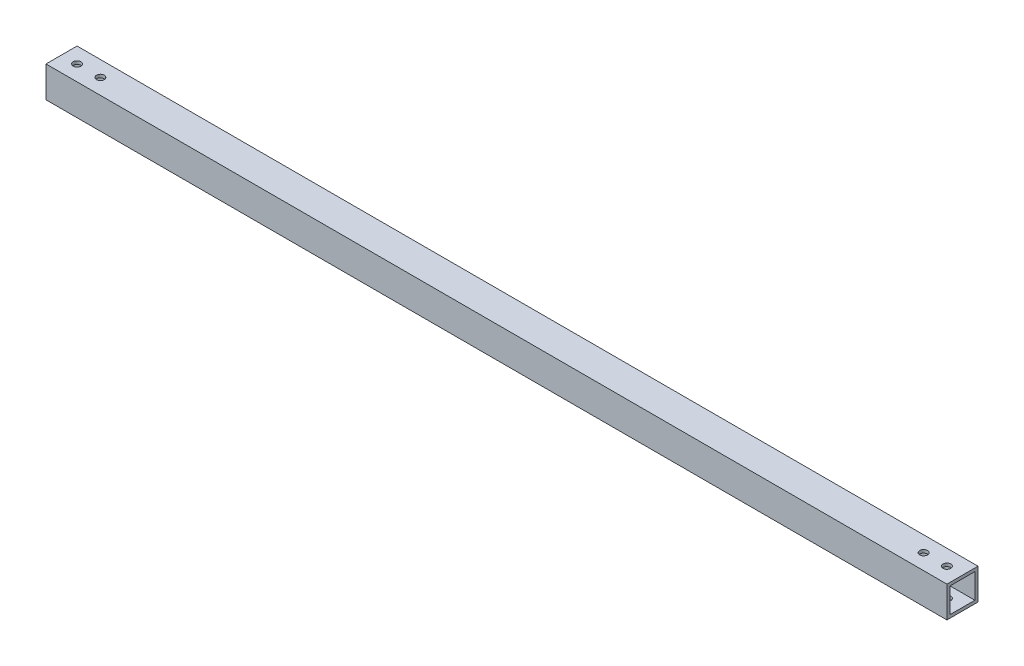
ISO-10303-21;
HEADER;
FILE_DESCRIPTION(('STEP AP214'),'2;1');
FILE_NAME('part.step','',(''),(''),'','','');
FILE_SCHEMA(('AUTOMOTIVE_DESIGN { 1 0 10303 214 1 1 1 1 }'));
ENDSEC;
DATA;
#1=APPLICATION_CONTEXT('core data for automotive mechanical design processes');
#2=APPLICATION_PROTOCOL_DEFINITION('international standard','automotive_design',2000,#1);
#3=PRODUCT_CONTEXT('',#1,'mechanical');
#4=PRODUCT('Part','Part','',(#3));
#5=PRODUCT_RELATED_PRODUCT_CATEGORY('part','',(#4));
#6=PRODUCT_DEFINITION_FORMATION('','',#4);
#7=PRODUCT_DEFINITION_CONTEXT('part definition',#1,'design');
#8=PRODUCT_DEFINITION('design','',#6,#7);
#9=PRODUCT_DEFINITION_SHAPE('','',#8);
#10=(LENGTH_UNIT() NAMED_UNIT(*) SI_UNIT(.MILLI.,.METRE.));
#11=(NAMED_UNIT(*) PLANE_ANGLE_UNIT() SI_UNIT($,.RADIAN.));
#12=(NAMED_UNIT(*) SI_UNIT($,.STERADIAN.) SOLID_ANGLE_UNIT());
#13=UNCERTAINTY_MEASURE_WITH_UNIT(LENGTH_MEASURE(1.E-05),#10,'distance_accuracy_value','');
#14=(GEOMETRIC_REPRESENTATION_CONTEXT(3) GLOBAL_UNCERTAINTY_ASSIGNED_CONTEXT((#13)) GLOBAL_UNIT_ASSIGNED_CONTEXT((#10,
#11,#12)) REPRESENTATION_CONTEXT('',''));
#15=CARTESIAN_POINT('',(0.,0.,0.));
#16=DIRECTION('',(0.,0.,1.));
#17=DIRECTION('',(1.,0.,0.));
#18=AXIS2_PLACEMENT_3D('',#15,#16,#17);
#19=CARTESIAN_POINT('',(580.,0.,0.));
#20=DIRECTION('',(1.,0.,0.));
#21=DIRECTION('',(0.,0.,-1.));
#22=AXIS2_PLACEMENT_3D('',#19,#20,#21);
#23=PLANE('',#22);
#24=DIRECTION('',(0.,1.,0.));
#25=VECTOR('',#24,1.);
#26=CARTESIAN_POINT('',(580.,10.,-9.99999999999999));
#27=LINE('',#26,#25);
#28=CARTESIAN_POINT('',(580.,-10.,-10.));
#29=VERTEX_POINT('',#28);
#30=CARTESIAN_POINT('',(580.,10.,-9.99999999999999));
#31=VERTEX_POINT('',#30);
#32=EDGE_CURVE('E138',#29,#31,#27,.T.);
#33=ORIENTED_EDGE('',*,*,#32,.T.);
#34=DIRECTION('',(0.,0.,1.));
#35=VECTOR('',#34,1.);
#36=CARTESIAN_POINT('',(580.,10.,10.));
#37=LINE('',#36,#35);
#38=CARTESIAN_POINT('',(580.,10.,10.));
#39=VERTEX_POINT('',#38);
#40=EDGE_CURVE('E141',#31,#39,#37,.T.);
#41=ORIENTED_EDGE('',*,*,#40,.T.);
#42=DIRECTION('',(0.,-1.,0.));
#43=VECTOR('',#42,1.);
#44=CARTESIAN_POINT('',(580.,10.,10.));
#45=LINE('',#44,#43);
#46=CARTESIAN_POINT('',(580.,-10.,10.));
#47=VERTEX_POINT('',#46);
#48=EDGE_CURVE('E144',#39,#47,#45,.T.);
#49=ORIENTED_EDGE('',*,*,#48,.T.);
#50=DIRECTION('',(0.,0.,-1.));
#51=VECTOR('',#50,1.);
#52=CARTESIAN_POINT('',(580.,-10.,10.));
#53=LINE('',#52,#51);
#54=EDGE_CURVE('E146',#47,#29,#53,.T.);
#55=ORIENTED_EDGE('',*,*,#54,.T.);
#56=EDGE_LOOP('',(#33,#41,#49,#55));
#57=FACE_BOUND('',#56,.T.);
#58=DIRECTION('',(0.,0.,1.));
#59=VECTOR('',#58,1.);
#60=CARTESIAN_POINT('',(580.,8.,8.));
#61=LINE('',#60,#59);
#62=CARTESIAN_POINT('',(580.,8.,-8.));
#63=VERTEX_POINT('',#62);
#64=CARTESIAN_POINT('',(580.,8.,8.));
#65=VERTEX_POINT('',#64);
#66=EDGE_CURVE('E108',#63,#65,#61,.T.);
#67=ORIENTED_EDGE('',*,*,#66,.F.);
#68=DIRECTION('',(0.,1.,0.));
#69=VECTOR('',#68,1.);
#70=CARTESIAN_POINT('',(580.,8.,-8.));
#71=LINE('',#70,#69);
#72=CARTESIAN_POINT('',(580.,-8.,-8.));
#73=VERTEX_POINT('',#72);
#74=EDGE_CURVE('E100',#73,#63,#71,.T.);
#75=ORIENTED_EDGE('',*,*,#74,.F.);
#76=DIRECTION('',(0.,0.,-1.));
#77=VECTOR('',#76,1.);
#78=CARTESIAN_POINT('',(580.,-8.,8.));
#79=LINE('',#78,#77);
#80=CARTESIAN_POINT('',(580.,-8.,8.));
#81=VERTEX_POINT('',#80);
#82=EDGE_CURVE('E122',#81,#73,#79,.T.);
#83=ORIENTED_EDGE('',*,*,#82,.F.);
#84=DIRECTION('',(0.,-1.,0.));
#85=VECTOR('',#84,1.);
#86=CARTESIAN_POINT('',(580.,8.,8.));
#87=LINE('',#86,#85);
#88=EDGE_CURVE('E120',#65,#81,#87,.T.);
#89=ORIENTED_EDGE('',*,*,#88,.F.);
#90=EDGE_LOOP('',(#67,#75,#83,#89));
#91=FACE_BOUND('',#90,.T.);
#92=ADVANCED_FACE('F33',(#57,#91),#23,.T.);
#93=CARTESIAN_POINT('',(0.,0.,0.));
#94=DIRECTION('',(1.,0.,0.));
#95=DIRECTION('',(0.,0.,-1.));
#96=AXIS2_PLACEMENT_3D('',#93,#94,#95);
#97=PLANE('',#96);
#98=DIRECTION('',(0.,1.,0.));
#99=VECTOR('',#98,1.);
#100=CARTESIAN_POINT('',(0.,10.,-9.99999999999999));
#101=LINE('',#100,#99);
#102=CARTESIAN_POINT('',(0.,-10.,-10.));
#103=VERTEX_POINT('',#102);
#104=CARTESIAN_POINT('',(0.,10.,-9.99999999999999));
#105=VERTEX_POINT('',#104);
#106=EDGE_CURVE('E116',#103,#105,#101,.T.);
#107=ORIENTED_EDGE('',*,*,#106,.F.);
#108=DIRECTION('',(0.,0.,-1.));
#109=VECTOR('',#108,1.);
#110=CARTESIAN_POINT('',(0.,-10.,10.));
#111=LINE('',#110,#109);
#112=CARTESIAN_POINT('',(0.,-10.,10.));
#113=VERTEX_POINT('',#112);
#114=EDGE_CURVE('E142',#113,#103,#111,.T.);
#115=ORIENTED_EDGE('',*,*,#114,.F.);
#116=DIRECTION('',(0.,-1.,0.));
#117=VECTOR('',#116,1.);
#118=CARTESIAN_POINT('',(0.,10.,10.));
#119=LINE('',#118,#117);
#120=CARTESIAN_POINT('',(0.,10.,10.));
#121=VERTEX_POINT('',#120);
#122=EDGE_CURVE('E153',#121,#113,#119,.T.);
#123=ORIENTED_EDGE('',*,*,#122,.F.);
#124=DIRECTION('',(0.,0.,1.));
#125=VECTOR('',#124,1.);
#126=CARTESIAN_POINT('',(0.,10.,10.));
#127=LINE('',#126,#125);
#128=EDGE_CURVE('E151',#105,#121,#127,.T.);
#129=ORIENTED_EDGE('',*,*,#128,.F.);
#130=EDGE_LOOP('',(#107,#115,#123,#129));
#131=FACE_BOUND('',#130,.T.);
#132=DIRECTION('',(0.,1.,0.));
#133=VECTOR('',#132,1.);
#134=CARTESIAN_POINT('',(0.,8.,-8.));
#135=LINE('',#134,#133);
#136=CARTESIAN_POINT('',(0.,-8.,-8.));
#137=VERTEX_POINT('',#136);
#138=CARTESIAN_POINT('',(0.,8.,-8.));
#139=VERTEX_POINT('',#138);
#140=EDGE_CURVE('E58',#137,#139,#135,.T.);
#141=ORIENTED_EDGE('',*,*,#140,.T.);
#142=DIRECTION('',(0.,0.,1.));
#143=VECTOR('',#142,1.);
#144=CARTESIAN_POINT('',(0.,8.,8.));
#145=LINE('',#144,#143);
#146=CARTESIAN_POINT('',(0.,8.,8.));
#147=VERTEX_POINT('',#146);
#148=EDGE_CURVE('E115',#139,#147,#145,.T.);
#149=ORIENTED_EDGE('',*,*,#148,.T.);
#150=DIRECTION('',(0.,-1.,0.));
#151=VECTOR('',#150,1.);
#152=CARTESIAN_POINT('',(0.,8.,8.));
#153=LINE('',#152,#151);
#154=CARTESIAN_POINT('',(0.,-8.,8.));
#155=VERTEX_POINT('',#154);
#156=EDGE_CURVE('E130',#147,#155,#153,.T.);
#157=ORIENTED_EDGE('',*,*,#156,.T.);
#158=DIRECTION('',(0.,0.,-1.));
#159=VECTOR('',#158,1.);
#160=CARTESIAN_POINT('',(0.,-8.,8.));
#161=LINE('',#160,#159);
#162=EDGE_CURVE('E109',#155,#137,#161,.T.);
#163=ORIENTED_EDGE('',*,*,#162,.T.);
#164=EDGE_LOOP('',(#141,#149,#157,#163));
#165=FACE_BOUND('',#164,.T.);
#166=ADVANCED_FACE('F205',(#131,#165),#97,.F.);
#167=CARTESIAN_POINT('',(580.,10.,-9.99999999999999));
#168=DIRECTION('',(0.,0.,1.));
#169=DIRECTION('',(0.,-1.,0.));
#170=AXIS2_PLACEMENT_3D('',#167,#168,#169);
#171=PLANE('',#170);
#172=ORIENTED_EDGE('',*,*,#106,.T.);
#173=DIRECTION('',(-1.,0.,0.));
#174=VECTOR('',#173,1.);
#175=CARTESIAN_POINT('',(580.,10.,-9.99999999999999));
#176=LINE('',#175,#174);
#177=EDGE_CURVE('E11',#31,#105,#176,.T.);
#178=ORIENTED_EDGE('',*,*,#177,.F.);
#179=ORIENTED_EDGE('',*,*,#32,.F.);
#180=DIRECTION('',(-1.,0.,0.));
#181=VECTOR('',#180,1.);
#182=CARTESIAN_POINT('',(580.,-10.,-10.));
#183=LINE('',#182,#181);
#184=EDGE_CURVE('E148',#29,#103,#183,.T.);
#185=ORIENTED_EDGE('',*,*,#184,.T.);
#186=EDGE_LOOP('',(#172,#178,#179,#185));
#187=FACE_BOUND('',#186,.T.);
#188=ADVANCED_FACE('F35',(#187),#171,.F.);
#189=CARTESIAN_POINT('',(580.,10.,10.));
#190=DIRECTION('',(0.,-1.,0.));
#191=DIRECTION('',(0.,0.,-1.));
#192=AXIS2_PLACEMENT_3D('',#189,#190,#191);
#193=PLANE('',#192);
#194=CARTESIAN_POINT('',(10.,10.,0.));
#195=DIRECTION('',(0.,1.,0.));
#196=DIRECTION('',(0.,0.,1.));
#197=AXIS2_PLACEMENT_3D('',#194,#195,#196);
#198=CIRCLE('',#197,2.5);
#199=CARTESIAN_POINT('',(10.,10.,2.5));
#200=VERTEX_POINT('',#199);
#201=EDGE_CURVE('E241',#200,#200,#198,.T.);
#202=ORIENTED_EDGE('',*,*,#201,.F.);
#203=EDGE_LOOP('',(#202));
#204=FACE_BOUND('',#203,.T.);
#205=CARTESIAN_POINT('',(555.,10.,1.04744440165294E-13));
#206=DIRECTION('',(0.,1.,0.));
#207=DIRECTION('',(0.,0.,1.));
#208=AXIS2_PLACEMENT_3D('',#205,#206,#207);
#209=CIRCLE('',#208,2.50000000000003);
#210=CARTESIAN_POINT('',(555.,10.,2.50000000000013));
#211=VERTEX_POINT('',#210);
#212=EDGE_CURVE('E245',#211,#211,#209,.T.);
#213=ORIENTED_EDGE('',*,*,#212,.F.);
#214=EDGE_LOOP('',(#213));
#215=FACE_BOUND('',#214,.T.);
#216=CARTESIAN_POINT('',(25.,10.,0.));
#217=DIRECTION('',(0.,1.,0.));
#218=DIRECTION('',(0.,0.,1.));
#219=AXIS2_PLACEMENT_3D('',#216,#217,#218);
#220=CIRCLE('',#219,2.5);
#221=CARTESIAN_POINT('',(25.,10.,2.5));
#222=VERTEX_POINT('',#221);
#223=EDGE_CURVE('E249',#222,#222,#220,.T.);
#224=ORIENTED_EDGE('',*,*,#223,.F.);
#225=EDGE_LOOP('',(#224));
#226=FACE_BOUND('',#225,.T.);
#227=CARTESIAN_POINT('',(570.,10.,0.));
#228=DIRECTION('',(0.,1.,0.));
#229=DIRECTION('',(0.,0.,1.));
#230=AXIS2_PLACEMENT_3D('',#227,#228,#229);
#231=CIRCLE('',#230,2.50000000000003);
#232=CARTESIAN_POINT('',(570.,10.,2.50000000000003));
#233=VERTEX_POINT('',#232);
#234=EDGE_CURVE('E253',#233,#233,#231,.T.);
#235=ORIENTED_EDGE('',*,*,#234,.F.);
#236=EDGE_LOOP('',(#235));
#237=FACE_BOUND('',#236,.T.);
#238=ORIENTED_EDGE('',*,*,#128,.T.);
#239=DIRECTION('',(-1.,0.,0.));
#240=VECTOR('',#239,1.);
#241=CARTESIAN_POINT('',(580.,10.,10.));
#242=LINE('',#241,#240);
#243=EDGE_CURVE('E42',#39,#121,#242,.T.);
#244=ORIENTED_EDGE('',*,*,#243,.F.);
#245=ORIENTED_EDGE('',*,*,#40,.F.);
#246=ORIENTED_EDGE('',*,*,#177,.T.);
#247=EDGE_LOOP('',(#238,#244,#245,#246));
#248=FACE_BOUND('',#247,.T.);
#249=ADVANCED_FACE('F230',(#204,#215,#226,#237,#248),#193,.F.);
#250=CARTESIAN_POINT('',(580.,10.,10.));
#251=DIRECTION('',(0.,0.,-1.));
#252=DIRECTION('',(0.,1.,0.));
#253=AXIS2_PLACEMENT_3D('',#250,#251,#252);
#254=PLANE('',#253);
#255=ORIENTED_EDGE('',*,*,#122,.T.);
#256=DIRECTION('',(-1.,0.,0.));
#257=VECTOR('',#256,1.);
#258=CARTESIAN_POINT('',(580.,-10.,10.));
#259=LINE('',#258,#257);
#260=EDGE_CURVE('E158',#47,#113,#259,.T.);
#261=ORIENTED_EDGE('',*,*,#260,.F.);
#262=ORIENTED_EDGE('',*,*,#48,.F.);
#263=ORIENTED_EDGE('',*,*,#243,.T.);
#264=EDGE_LOOP('',(#255,#261,#262,#263));
#265=FACE_BOUND('',#264,.T.);
#266=ADVANCED_FACE('F227',(#265),#254,.F.);
#267=CARTESIAN_POINT('',(580.,-10.,10.));
#268=DIRECTION('',(0.,1.,0.));
#269=DIRECTION('',(0.,0.,1.));
#270=AXIS2_PLACEMENT_3D('',#267,#268,#269);
#271=PLANE('',#270);
#272=CARTESIAN_POINT('',(10.,-10.,0.));
#273=DIRECTION('',(0.,1.,0.));
#274=DIRECTION('',(0.,0.,1.));
#275=AXIS2_PLACEMENT_3D('',#272,#273,#274);
#276=CIRCLE('',#275,2.5);
#277=CARTESIAN_POINT('',(10.,-10.,2.5));
#278=VERTEX_POINT('',#277);
#279=EDGE_CURVE('E167',#278,#278,#276,.T.);
#280=ORIENTED_EDGE('',*,*,#279,.T.);
#281=EDGE_LOOP('',(#280));
#282=FACE_BOUND('',#281,.T.);
#283=CARTESIAN_POINT('',(555.,-10.,1.04744440165294E-13));
#284=DIRECTION('',(0.,1.,0.));
#285=DIRECTION('',(0.,0.,1.));
#286=AXIS2_PLACEMENT_3D('',#283,#284,#285);
#287=CIRCLE('',#286,2.50000000000003);
#288=CARTESIAN_POINT('',(555.,-10.,2.50000000000013));
#289=VERTEX_POINT('',#288);
#290=EDGE_CURVE('E274',#289,#289,#287,.T.);
#291=ORIENTED_EDGE('',*,*,#290,.T.);
#292=EDGE_LOOP('',(#291));
#293=FACE_BOUND('',#292,.T.);
#294=CARTESIAN_POINT('',(25.,-10.,0.));
#295=DIRECTION('',(0.,1.,0.));
#296=DIRECTION('',(0.,0.,1.));
#297=AXIS2_PLACEMENT_3D('',#294,#295,#296);
#298=CIRCLE('',#297,2.5);
#299=CARTESIAN_POINT('',(25.,-10.,2.5));
#300=VERTEX_POINT('',#299);
#301=EDGE_CURVE('E267',#300,#300,#298,.T.);
#302=ORIENTED_EDGE('',*,*,#301,.T.);
#303=EDGE_LOOP('',(#302));
#304=FACE_BOUND('',#303,.T.);
#305=CARTESIAN_POINT('',(570.,-10.,0.));
#306=DIRECTION('',(0.,1.,0.));
#307=DIRECTION('',(0.,0.,1.));
#308=AXIS2_PLACEMENT_3D('',#305,#306,#307);
#309=CIRCLE('',#308,2.50000000000003);
#310=CARTESIAN_POINT('',(570.,-10.,2.50000000000003));
#311=VERTEX_POINT('',#310);
#312=EDGE_CURVE('E266',#311,#311,#309,.T.);
#313=ORIENTED_EDGE('',*,*,#312,.T.);
#314=EDGE_LOOP('',(#313));
#315=FACE_BOUND('',#314,.T.);
#316=ORIENTED_EDGE('',*,*,#114,.T.);
#317=ORIENTED_EDGE('',*,*,#184,.F.);
#318=ORIENTED_EDGE('',*,*,#54,.F.);
#319=ORIENTED_EDGE('',*,*,#260,.T.);
#320=EDGE_LOOP('',(#316,#317,#318,#319));
#321=FACE_BOUND('',#320,.T.);
#322=ADVANCED_FACE('F224',(#282,#293,#304,#315,#321),#271,.F.);
#323=CARTESIAN_POINT('',(580.,8.,-8.));
#324=DIRECTION('',(0.,0.,1.));
#325=DIRECTION('',(0.,-1.,0.));
#326=AXIS2_PLACEMENT_3D('',#323,#324,#325);
#327=PLANE('',#326);
#328=ORIENTED_EDGE('',*,*,#140,.F.);
#329=DIRECTION('',(-1.,0.,0.));
#330=VECTOR('',#329,1.);
#331=CARTESIAN_POINT('',(580.,-8.,-8.));
#332=LINE('',#331,#330);
#333=EDGE_CURVE('E104',#73,#137,#332,.T.);
#334=ORIENTED_EDGE('',*,*,#333,.F.);
#335=ORIENTED_EDGE('',*,*,#74,.T.);
#336=DIRECTION('',(-1.,0.,0.));
#337=VECTOR('',#336,1.);
#338=CARTESIAN_POINT('',(580.,8.,-8.));
#339=LINE('',#338,#337);
#340=EDGE_CURVE('E103',#63,#139,#339,.T.);
#341=ORIENTED_EDGE('',*,*,#340,.T.);
#342=EDGE_LOOP('',(#328,#334,#335,#341));
#343=FACE_BOUND('',#342,.T.);
#344=ADVANCED_FACE('F102',(#343),#327,.T.);
#345=CARTESIAN_POINT('',(580.,8.,8.));
#346=DIRECTION('',(0.,-1.,0.));
#347=DIRECTION('',(0.,0.,-1.));
#348=AXIS2_PLACEMENT_3D('',#345,#346,#347);
#349=PLANE('',#348);
#350=CARTESIAN_POINT('',(10.,8.,0.));
#351=DIRECTION('',(0.,-1.,0.));
#352=DIRECTION('',(0.,0.,-1.));
#353=AXIS2_PLACEMENT_3D('',#350,#351,#352);
#354=CIRCLE('',#353,2.5);
#355=CARTESIAN_POINT('',(10.,8.,-2.5));
#356=VERTEX_POINT('',#355);
#357=EDGE_CURVE('E128',#356,#356,#354,.T.);
#358=ORIENTED_EDGE('',*,*,#357,.F.);
#359=EDGE_LOOP('',(#358));
#360=FACE_BOUND('',#359,.T.);
#361=CARTESIAN_POINT('',(555.,8.,1.04744440165294E-13));
#362=DIRECTION('',(0.,-1.,0.));
#363=DIRECTION('',(0.,0.,-1.));
#364=AXIS2_PLACEMENT_3D('',#361,#362,#363);
#365=CIRCLE('',#364,2.50000000000003);
#366=CARTESIAN_POINT('',(555.,8.,-2.49999999999992));
#367=VERTEX_POINT('',#366);
#368=EDGE_CURVE('E173',#367,#367,#365,.T.);
#369=ORIENTED_EDGE('',*,*,#368,.F.);
#370=EDGE_LOOP('',(#369));
#371=FACE_BOUND('',#370,.T.);
#372=CARTESIAN_POINT('',(25.,8.,0.));
#373=DIRECTION('',(0.,-1.,0.));
#374=DIRECTION('',(0.,0.,-1.));
#375=AXIS2_PLACEMENT_3D('',#372,#373,#374);
#376=CIRCLE('',#375,2.5);
#377=CARTESIAN_POINT('',(25.,8.,-2.5));
#378=VERTEX_POINT('',#377);
#379=EDGE_CURVE('E170',#378,#378,#376,.T.);
#380=ORIENTED_EDGE('',*,*,#379,.F.);
#381=EDGE_LOOP('',(#380));
#382=FACE_BOUND('',#381,.T.);
#383=CARTESIAN_POINT('',(570.,8.,0.));
#384=DIRECTION('',(0.,-1.,0.));
#385=DIRECTION('',(0.,0.,-1.));
#386=AXIS2_PLACEMENT_3D('',#383,#384,#385);
#387=CIRCLE('',#386,2.50000000000003);
#388=CARTESIAN_POINT('',(570.,8.,-2.50000000000003));
#389=VERTEX_POINT('',#388);
#390=EDGE_CURVE('E166',#389,#389,#387,.T.);
#391=ORIENTED_EDGE('',*,*,#390,.F.);
#392=EDGE_LOOP('',(#391));
#393=FACE_BOUND('',#392,.T.);
#394=ORIENTED_EDGE('',*,*,#148,.F.);
#395=ORIENTED_EDGE('',*,*,#340,.F.);
#396=ORIENTED_EDGE('',*,*,#66,.T.);
#397=DIRECTION('',(-1.,0.,0.));
#398=VECTOR('',#397,1.);
#399=CARTESIAN_POINT('',(580.,8.,8.));
#400=LINE('',#399,#398);
#401=EDGE_CURVE('E117',#65,#147,#400,.T.);
#402=ORIENTED_EDGE('',*,*,#401,.T.);
#403=EDGE_LOOP('',(#394,#395,#396,#402));
#404=FACE_BOUND('',#403,.T.);
#405=ADVANCED_FACE('F112',(#360,#371,#382,#393,#404),#349,.T.);
#406=CARTESIAN_POINT('',(580.,8.,8.));
#407=DIRECTION('',(0.,0.,-1.));
#408=DIRECTION('',(0.,1.,0.));
#409=AXIS2_PLACEMENT_3D('',#406,#407,#408);
#410=PLANE('',#409);
#411=ORIENTED_EDGE('',*,*,#156,.F.);
#412=ORIENTED_EDGE('',*,*,#401,.F.);
#413=ORIENTED_EDGE('',*,*,#88,.T.);
#414=DIRECTION('',(-1.,0.,0.));
#415=VECTOR('',#414,1.);
#416=CARTESIAN_POINT('',(580.,-8.,8.));
#417=LINE('',#416,#415);
#418=EDGE_CURVE('E50',#81,#155,#417,.T.);
#419=ORIENTED_EDGE('',*,*,#418,.T.);
#420=EDGE_LOOP('',(#411,#412,#413,#419));
#421=FACE_BOUND('',#420,.T.);
#422=ADVANCED_FACE('F197',(#421),#410,.T.);
#423=CARTESIAN_POINT('',(580.,-8.,8.));
#424=DIRECTION('',(0.,1.,0.));
#425=DIRECTION('',(0.,0.,1.));
#426=AXIS2_PLACEMENT_3D('',#423,#424,#425);
#427=PLANE('',#426);
#428=CARTESIAN_POINT('',(10.,-8.,0.));
#429=DIRECTION('',(0.,1.,0.));
#430=DIRECTION('',(0.,0.,1.));
#431=AXIS2_PLACEMENT_3D('',#428,#429,#430);
#432=CIRCLE('',#431,2.5);
#433=CARTESIAN_POINT('',(10.,-8.,2.5));
#434=VERTEX_POINT('',#433);
#435=EDGE_CURVE('E37',#434,#434,#432,.T.);
#436=ORIENTED_EDGE('',*,*,#435,.F.);
#437=EDGE_LOOP('',(#436));
#438=FACE_BOUND('',#437,.T.);
#439=CARTESIAN_POINT('',(555.,-8.,1.04744440165294E-13));
#440=DIRECTION('',(0.,1.,0.));
#441=DIRECTION('',(0.,0.,1.));
#442=AXIS2_PLACEMENT_3D('',#439,#440,#441);
#443=CIRCLE('',#442,2.50000000000003);
#444=CARTESIAN_POINT('',(555.,-8.,2.50000000000013));
#445=VERTEX_POINT('',#444);
#446=EDGE_CURVE('E171',#445,#445,#443,.T.);
#447=ORIENTED_EDGE('',*,*,#446,.F.);
#448=EDGE_LOOP('',(#447));
#449=FACE_BOUND('',#448,.T.);
#450=CARTESIAN_POINT('',(25.,-8.,0.));
#451=DIRECTION('',(0.,1.,0.));
#452=DIRECTION('',(0.,0.,1.));
#453=AXIS2_PLACEMENT_3D('',#450,#451,#452);
#454=CIRCLE('',#453,2.5);
#455=CARTESIAN_POINT('',(25.,-8.,2.5));
#456=VERTEX_POINT('',#455);
#457=EDGE_CURVE('E168',#456,#456,#454,.T.);
#458=ORIENTED_EDGE('',*,*,#457,.F.);
#459=EDGE_LOOP('',(#458));
#460=FACE_BOUND('',#459,.T.);
#461=CARTESIAN_POINT('',(570.,-8.,0.));
#462=DIRECTION('',(0.,1.,0.));
#463=DIRECTION('',(0.,0.,1.));
#464=AXIS2_PLACEMENT_3D('',#461,#462,#463);
#465=CIRCLE('',#464,2.50000000000003);
#466=CARTESIAN_POINT('',(570.,-8.,2.50000000000003));
#467=VERTEX_POINT('',#466);
#468=EDGE_CURVE('E163',#467,#467,#465,.T.);
#469=ORIENTED_EDGE('',*,*,#468,.F.);
#470=EDGE_LOOP('',(#469));
#471=FACE_BOUND('',#470,.T.);
#472=ORIENTED_EDGE('',*,*,#162,.F.);
#473=ORIENTED_EDGE('',*,*,#418,.F.);
#474=ORIENTED_EDGE('',*,*,#82,.T.);
#475=ORIENTED_EDGE('',*,*,#333,.T.);
#476=EDGE_LOOP('',(#472,#473,#474,#475));
#477=FACE_BOUND('',#476,.T.);
#478=ADVANCED_FACE('F193',(#438,#449,#460,#471,#477),#427,.T.);
#479=CARTESIAN_POINT('',(570.,-10.,0.));
#480=DIRECTION('',(0.,1.,0.));
#481=DIRECTION('',(0.,0.,1.));
#482=AXIS2_PLACEMENT_3D('',#479,#480,#481);
#483=CYLINDRICAL_SURFACE('',#482,2.50000000000003);
#484=ORIENTED_EDGE('',*,*,#468,.T.);
#485=EDGE_LOOP('',(#484));
#486=FACE_BOUND('',#485,.T.);
#487=ORIENTED_EDGE('',*,*,#312,.F.);
#488=EDGE_LOOP('',(#487));
#489=FACE_BOUND('',#488,.T.);
#490=ADVANCED_FACE('F196',(#486,#489),#483,.F.);
#491=CARTESIAN_POINT('',(25.,-10.,0.));
#492=DIRECTION('',(0.,1.,0.));
#493=DIRECTION('',(0.,0.,1.));
#494=AXIS2_PLACEMENT_3D('',#491,#492,#493);
#495=CYLINDRICAL_SURFACE('',#494,2.5);
#496=ORIENTED_EDGE('',*,*,#457,.T.);
#497=EDGE_LOOP('',(#496));
#498=FACE_BOUND('',#497,.T.);
#499=ORIENTED_EDGE('',*,*,#301,.F.);
#500=EDGE_LOOP('',(#499));
#501=FACE_BOUND('',#500,.T.);
#502=ADVANCED_FACE('F296',(#498,#501),#495,.F.);
#503=CARTESIAN_POINT('',(555.,-10.,1.04744440165294E-13));
#504=DIRECTION('',(0.,1.,0.));
#505=DIRECTION('',(0.,0.,1.));
#506=AXIS2_PLACEMENT_3D('',#503,#504,#505);
#507=CYLINDRICAL_SURFACE('',#506,2.50000000000003);
#508=ORIENTED_EDGE('',*,*,#446,.T.);
#509=EDGE_LOOP('',(#508));
#510=FACE_BOUND('',#509,.T.);
#511=ORIENTED_EDGE('',*,*,#290,.F.);
#512=EDGE_LOOP('',(#511));
#513=FACE_BOUND('',#512,.T.);
#514=ADVANCED_FACE('F286',(#510,#513),#507,.F.);
#515=CARTESIAN_POINT('',(10.,-10.,0.));
#516=DIRECTION('',(0.,1.,0.));
#517=DIRECTION('',(0.,0.,1.));
#518=AXIS2_PLACEMENT_3D('',#515,#516,#517);
#519=CYLINDRICAL_SURFACE('',#518,2.5);
#520=ORIENTED_EDGE('',*,*,#435,.T.);
#521=EDGE_LOOP('',(#520));
#522=FACE_BOUND('',#521,.T.);
#523=ORIENTED_EDGE('',*,*,#279,.F.);
#524=EDGE_LOOP('',(#523));
#525=FACE_BOUND('',#524,.T.);
#526=ADVANCED_FACE('F190',(#522,#525),#519,.F.);
#527=ORIENTED_EDGE('',*,*,#390,.T.);
#528=EDGE_LOOP('',(#527));
#529=FACE_BOUND('',#528,.T.);
#530=ORIENTED_EDGE('',*,*,#234,.T.);
#531=EDGE_LOOP('',(#530));
#532=FACE_BOUND('',#531,.T.);
#533=ADVANCED_FACE('F285',(#529,#532),#483,.F.);
#534=ORIENTED_EDGE('',*,*,#379,.T.);
#535=EDGE_LOOP('',(#534));
#536=FACE_BOUND('',#535,.T.);
#537=ORIENTED_EDGE('',*,*,#223,.T.);
#538=EDGE_LOOP('',(#537));
#539=FACE_BOUND('',#538,.T.);
#540=ADVANCED_FACE('F293',(#536,#539),#495,.F.);
#541=ORIENTED_EDGE('',*,*,#368,.T.);
#542=EDGE_LOOP('',(#541));
#543=FACE_BOUND('',#542,.T.);
#544=ORIENTED_EDGE('',*,*,#212,.T.);
#545=EDGE_LOOP('',(#544));
#546=FACE_BOUND('',#545,.T.);
#547=ADVANCED_FACE('F298',(#543,#546),#507,.F.);
#548=ORIENTED_EDGE('',*,*,#357,.T.);
#549=EDGE_LOOP('',(#548));
#550=FACE_BOUND('',#549,.T.);
#551=ORIENTED_EDGE('',*,*,#201,.T.);
#552=EDGE_LOOP('',(#551));
#553=FACE_BOUND('',#552,.T.);
#554=ADVANCED_FACE('F288',(#550,#553),#519,.F.);
#555=CLOSED_SHELL('',(#92,#166,#188,#249,#266,#322,#344,#405,#422,#478,#490,#502,#514,#526,#533,
#540,#547,#554));
#556=MANIFOLD_SOLID_BREP('B2',#555);
#557=ADVANCED_BREP_SHAPE_REPRESENTATION('',(#18,#556),#14);
#558=SHAPE_DEFINITION_REPRESENTATION(#9,#557);
ENDSEC;
END-ISO-10303-21;
